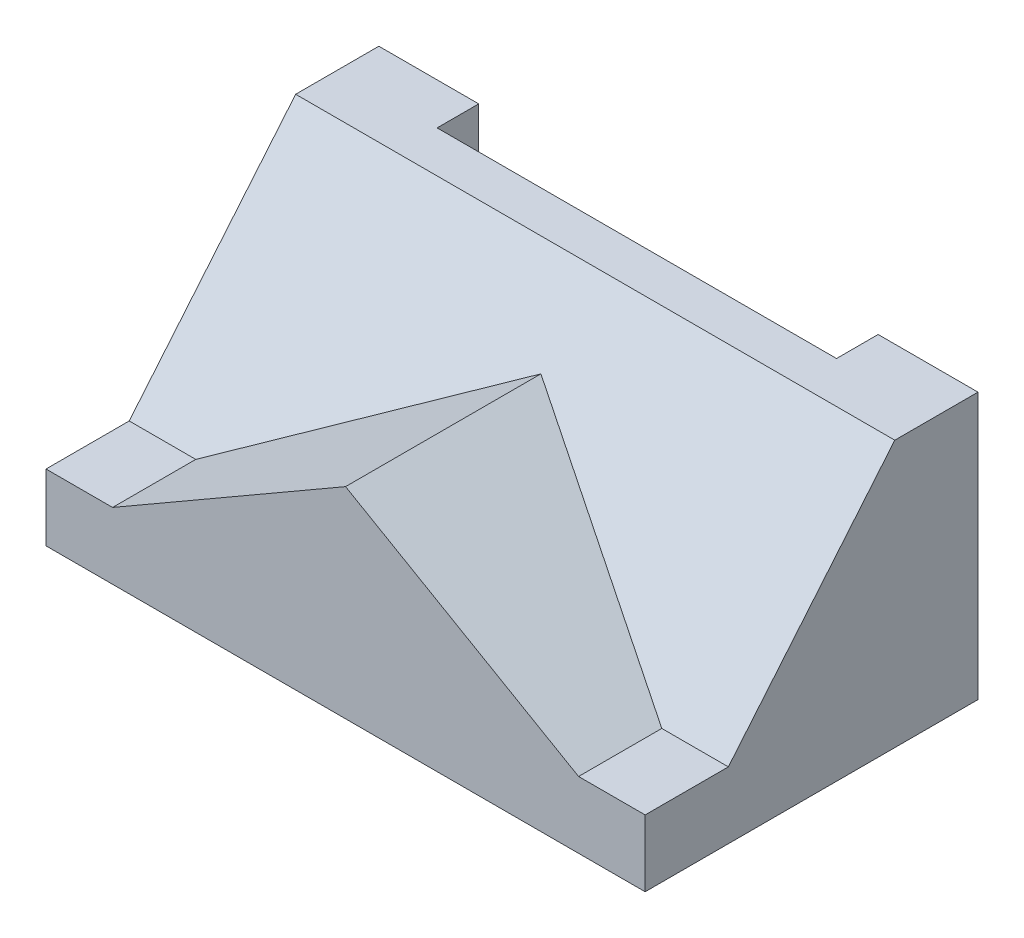
ISO-10303-21;
HEADER;
FILE_DESCRIPTION(('STEP AP214'),'2;1');
FILE_NAME('part.step','',(''),(''),'','','');
FILE_SCHEMA(('AUTOMOTIVE_DESIGN { 1 0 10303 214 1 1 1 1 }'));
ENDSEC;
DATA;
#1=APPLICATION_CONTEXT('core data for automotive mechanical design processes');
#2=APPLICATION_PROTOCOL_DEFINITION('international standard','automotive_design',2000,#1);
#3=PRODUCT_CONTEXT('',#1,'mechanical');
#4=PRODUCT('Part','Part','',(#3));
#5=PRODUCT_RELATED_PRODUCT_CATEGORY('part','',(#4));
#6=PRODUCT_DEFINITION_FORMATION('','',#4);
#7=PRODUCT_DEFINITION_CONTEXT('part definition',#1,'design');
#8=PRODUCT_DEFINITION('design','',#6,#7);
#9=PRODUCT_DEFINITION_SHAPE('','',#8);
#10=(LENGTH_UNIT() NAMED_UNIT(*) SI_UNIT(.MILLI.,.METRE.));
#11=(NAMED_UNIT(*) PLANE_ANGLE_UNIT() SI_UNIT($,.RADIAN.));
#12=(NAMED_UNIT(*) SI_UNIT($,.STERADIAN.) SOLID_ANGLE_UNIT());
#13=UNCERTAINTY_MEASURE_WITH_UNIT(LENGTH_MEASURE(1.E-05),#10,'distance_accuracy_value','');
#14=(GEOMETRIC_REPRESENTATION_CONTEXT(3) GLOBAL_UNCERTAINTY_ASSIGNED_CONTEXT((#13)) GLOBAL_UNIT_ASSIGNED_CONTEXT((#10,
#11,#12)) REPRESENTATION_CONTEXT('',''));
#15=CARTESIAN_POINT('',(0.,0.,0.));
#16=DIRECTION('',(0.,0.,1.));
#17=DIRECTION('',(1.,0.,0.));
#18=AXIS2_PLACEMENT_3D('',#15,#16,#17);
#19=CARTESIAN_POINT('',(-114.3,50.8,-15.875));
#20=DIRECTION('',(0.,0.64018439966448,0.768221279597376));
#21=DIRECTION('',(0.,-0.768221279597376,0.64018439966448));
#22=AXIS2_PLACEMENT_3D('',#19,#20,#21);
#23=PLANE('',#22);
#24=DIRECTION('',(-0.799408065031789,-0.461538461538462,0.384615384615385));
#25=VECTOR('',#24,1.);
#26=CARTESIAN_POINT('',(-5.32875091001085,68.2822315773269,-30.4435263144391));
#27=LINE('',#26,#25);
#28=CARTESIAN_POINT('',(-57.15,38.3632194654789,-5.51101622123245));
#29=VERTEX_POINT('',#28);
#30=CARTESIAN_POINT('',(-101.6,12.7,15.875));
#31=VERTEX_POINT('',#30);
#32=EDGE_CURVE('E49',#29,#31,#27,.T.);
#33=ORIENTED_EDGE('',*,*,#32,.F.);
#34=DIRECTION('',(-0.799408065031789,0.461538461538463,-0.384615384615385));
#35=VECTOR('',#34,1.);
#36=CARTESIAN_POINT('',(-35.9274621077408,26.110381500496,4.69968208291999));
#37=LINE('',#36,#35);
#38=CARTESIAN_POINT('',(-12.7,12.7,15.875));
#39=VERTEX_POINT('',#38);
#40=EDGE_CURVE('E222',#39,#29,#37,.T.);
#41=ORIENTED_EDGE('',*,*,#40,.F.);
#42=DIRECTION('',(1.,0.,0.));
#43=VECTOR('',#42,1.);
#44=CARTESIAN_POINT('',(-114.3,12.7,15.875));
#45=LINE('',#44,#43);
#46=CARTESIAN_POINT('',(0.,12.7,15.875));
#47=VERTEX_POINT('',#46);
#48=EDGE_CURVE('E147',#39,#47,#45,.T.);
#49=ORIENTED_EDGE('',*,*,#48,.T.);
#50=DIRECTION('',(0.,-0.768221279597376,0.64018439966448));
#51=VECTOR('',#50,1.);
#52=CARTESIAN_POINT('',(0.,50.8,-15.875));
#53=LINE('',#52,#51);
#54=CARTESIAN_POINT('',(0.,50.8,-15.875));
#55=VERTEX_POINT('',#54);
#56=EDGE_CURVE('E179',#55,#47,#53,.T.);
#57=ORIENTED_EDGE('',*,*,#56,.F.);
#58=DIRECTION('',(1.,0.,0.));
#59=VECTOR('',#58,1.);
#60=CARTESIAN_POINT('',(-114.3,50.8,-15.875));
#61=LINE('',#60,#59);
#62=CARTESIAN_POINT('',(-114.3,50.8,-15.875));
#63=VERTEX_POINT('',#62);
#64=EDGE_CURVE('E11',#63,#55,#61,.T.);
#65=ORIENTED_EDGE('',*,*,#64,.F.);
#66=DIRECTION('',(0.,-0.768221279597376,0.64018439966448));
#67=VECTOR('',#66,1.);
#68=CARTESIAN_POINT('',(-114.3,50.8,-15.875));
#69=LINE('',#68,#67);
#70=CARTESIAN_POINT('',(-114.3,12.7,15.875));
#71=VERTEX_POINT('',#70);
#72=EDGE_CURVE('E169',#63,#71,#69,.T.);
#73=ORIENTED_EDGE('',*,*,#72,.T.);
#74=EDGE_CURVE('E36',#71,#31,#45,.T.);
#75=ORIENTED_EDGE('',*,*,#74,.T.);
#76=EDGE_LOOP('',(#33,#41,#49,#57,#65,#73,#75));
#77=FACE_BOUND('',#76,.T.);
#78=ADVANCED_FACE('F33',(#77),#23,.T.);
#79=CARTESIAN_POINT('',(-114.3,12.7,15.875));
#80=DIRECTION('',(0.,1.,0.));
#81=DIRECTION('',(0.,0.,1.));
#82=AXIS2_PLACEMENT_3D('',#79,#80,#81);
#83=PLANE('',#82);
#84=ORIENTED_EDGE('',*,*,#48,.F.);
#85=DIRECTION('',(0.,0.,1.));
#86=VECTOR('',#85,1.);
#87=CARTESIAN_POINT('',(-12.7,12.7,-101.30660342681));
#88=LINE('',#87,#86);
#89=CARTESIAN_POINT('',(-12.7,12.7,31.75));
#90=VERTEX_POINT('',#89);
#91=EDGE_CURVE('E132',#39,#90,#88,.T.);
#92=ORIENTED_EDGE('',*,*,#91,.T.);
#93=DIRECTION('',(1.,0.,0.));
#94=VECTOR('',#93,1.);
#95=CARTESIAN_POINT('',(-114.3,12.7,31.75));
#96=LINE('',#95,#94);
#97=CARTESIAN_POINT('',(0.,12.7,31.75));
#98=VERTEX_POINT('',#97);
#99=EDGE_CURVE('E145',#90,#98,#96,.T.);
#100=ORIENTED_EDGE('',*,*,#99,.T.);
#101=DIRECTION('',(0.,0.,1.));
#102=VECTOR('',#101,1.);
#103=CARTESIAN_POINT('',(0.,12.7,15.875));
#104=LINE('',#103,#102);
#105=EDGE_CURVE('E177',#47,#98,#104,.T.);
#106=ORIENTED_EDGE('',*,*,#105,.F.);
#107=EDGE_LOOP('',(#84,#92,#100,#106));
#108=FACE_BOUND('',#107,.T.);
#109=ADVANCED_FACE('F143',(#108),#83,.T.);
#110=CARTESIAN_POINT('',(-114.3,12.7,31.75));
#111=VERTEX_POINT('',#110);
#112=CARTESIAN_POINT('',(-101.6,12.7,31.75));
#113=VERTEX_POINT('',#112);
#114=EDGE_CURVE('E153',#111,#113,#96,.T.);
#115=ORIENTED_EDGE('',*,*,#114,.T.);
#116=DIRECTION('',(0.,0.,1.));
#117=VECTOR('',#116,1.);
#118=CARTESIAN_POINT('',(-101.6,12.7,-101.30660342681));
#119=LINE('',#118,#117);
#120=EDGE_CURVE('E223',#31,#113,#119,.T.);
#121=ORIENTED_EDGE('',*,*,#120,.F.);
#122=ORIENTED_EDGE('',*,*,#74,.F.);
#123=DIRECTION('',(0.,0.,1.));
#124=VECTOR('',#123,1.);
#125=CARTESIAN_POINT('',(-114.3,12.7,15.875));
#126=LINE('',#125,#124);
#127=EDGE_CURVE('E195',#71,#111,#126,.T.);
#128=ORIENTED_EDGE('',*,*,#127,.T.);
#129=EDGE_LOOP('',(#115,#121,#122,#128));
#130=FACE_BOUND('',#129,.T.);
#131=ADVANCED_FACE('F231',(#130),#83,.T.);
#132=CARTESIAN_POINT('',(-114.3,0.,-31.75));
#133=DIRECTION('',(0.,0.,-1.));
#134=DIRECTION('',(-1.,0.,0.));
#135=AXIS2_PLACEMENT_3D('',#132,#133,#134);
#136=PLANE('',#135);
#137=DIRECTION('',(0.,1.,0.));
#138=VECTOR('',#137,1.);
#139=CARTESIAN_POINT('',(-95.25,0.,-31.75));
#140=LINE('',#139,#138);
#141=CARTESIAN_POINT('',(-95.25,0.,-31.75));
#142=VERTEX_POINT('',#141);
#143=CARTESIAN_POINT('',(-95.25,50.8,-31.75));
#144=VERTEX_POINT('',#143);
#145=EDGE_CURVE('E211',#142,#144,#140,.T.);
#146=ORIENTED_EDGE('',*,*,#145,.F.);
#147=DIRECTION('',(1.,0.,0.));
#148=VECTOR('',#147,1.);
#149=CARTESIAN_POINT('',(-114.3,0.,-31.75));
#150=LINE('',#149,#148);
#151=CARTESIAN_POINT('',(-114.3,0.,-31.75));
#152=VERTEX_POINT('',#151);
#153=EDGE_CURVE('E160',#152,#142,#150,.T.);
#154=ORIENTED_EDGE('',*,*,#153,.F.);
#155=DIRECTION('',(0.,1.,0.));
#156=VECTOR('',#155,1.);
#157=CARTESIAN_POINT('',(-114.3,0.,-31.75));
#158=LINE('',#157,#156);
#159=CARTESIAN_POINT('',(-114.3,50.8,-31.75));
#160=VERTEX_POINT('',#159);
#161=EDGE_CURVE('E186',#152,#160,#158,.T.);
#162=ORIENTED_EDGE('',*,*,#161,.T.);
#163=DIRECTION('',(1.,0.,0.));
#164=VECTOR('',#163,1.);
#165=CARTESIAN_POINT('',(-114.3,50.8,-31.75));
#166=LINE('',#165,#164);
#167=EDGE_CURVE('E41',#160,#144,#166,.T.);
#168=ORIENTED_EDGE('',*,*,#167,.T.);
#169=EDGE_LOOP('',(#146,#154,#162,#168));
#170=FACE_BOUND('',#169,.T.);
#171=ADVANCED_FACE('F265',(#170),#136,.T.);
#172=CARTESIAN_POINT('',(-114.3,50.8,-31.75));
#173=DIRECTION('',(0.,1.,0.));
#174=DIRECTION('',(0.,0.,1.));
#175=AXIS2_PLACEMENT_3D('',#172,#173,#174);
#176=PLANE('',#175);
#177=DIRECTION('',(0.,0.,1.));
#178=VECTOR('',#177,1.);
#179=CARTESIAN_POINT('',(-95.25,50.8,-31.75));
#180=LINE('',#179,#178);
#181=CARTESIAN_POINT('',(-95.25,50.8,-23.8125));
#182=VERTEX_POINT('',#181);
#183=EDGE_CURVE('E201',#144,#182,#180,.T.);
#184=ORIENTED_EDGE('',*,*,#183,.F.);
#185=ORIENTED_EDGE('',*,*,#167,.F.);
#186=DIRECTION('',(0.,0.,1.));
#187=VECTOR('',#186,1.);
#188=CARTESIAN_POINT('',(-114.3,50.8,-31.75));
#189=LINE('',#188,#187);
#190=EDGE_CURVE('E183',#160,#63,#189,.T.);
#191=ORIENTED_EDGE('',*,*,#190,.T.);
#192=ORIENTED_EDGE('',*,*,#64,.T.);
#193=DIRECTION('',(0.,0.,1.));
#194=VECTOR('',#193,1.);
#195=CARTESIAN_POINT('',(0.,50.8,-31.75));
#196=LINE('',#195,#194);
#197=CARTESIAN_POINT('',(0.,50.8,-31.75));
#198=VERTEX_POINT('',#197);
#199=EDGE_CURVE('E166',#198,#55,#196,.T.);
#200=ORIENTED_EDGE('',*,*,#199,.F.);
#201=CARTESIAN_POINT('',(-19.05,50.8,-31.75));
#202=VERTEX_POINT('',#201);
#203=EDGE_CURVE('E163',#202,#198,#166,.T.);
#204=ORIENTED_EDGE('',*,*,#203,.F.);
#205=DIRECTION('',(0.,0.,-1.));
#206=VECTOR('',#205,1.);
#207=CARTESIAN_POINT('',(-19.05,50.8,-31.75));
#208=LINE('',#207,#206);
#209=CARTESIAN_POINT('',(-19.05,50.8,-23.8125));
#210=VERTEX_POINT('',#209);
#211=EDGE_CURVE('E203',#210,#202,#208,.T.);
#212=ORIENTED_EDGE('',*,*,#211,.F.);
#213=DIRECTION('',(1.,0.,0.));
#214=VECTOR('',#213,1.);
#215=CARTESIAN_POINT('',(-114.3,50.8,-23.8125));
#216=LINE('',#215,#214);
#217=EDGE_CURVE('E182',#182,#210,#216,.T.);
#218=ORIENTED_EDGE('',*,*,#217,.F.);
#219=EDGE_LOOP('',(#184,#185,#191,#192,#200,#204,#212,#218));
#220=FACE_BOUND('',#219,.T.);
#221=ADVANCED_FACE('F243',(#220),#176,.T.);
#222=DIRECTION('',(0.,1.,0.));
#223=VECTOR('',#222,1.);
#224=CARTESIAN_POINT('',(-19.05,0.,-31.75));
#225=LINE('',#224,#223);
#226=CARTESIAN_POINT('',(-19.05,0.,-31.75));
#227=VERTEX_POINT('',#226);
#228=EDGE_CURVE('E57',#227,#202,#225,.T.);
#229=ORIENTED_EDGE('',*,*,#228,.T.);
#230=ORIENTED_EDGE('',*,*,#203,.T.);
#231=DIRECTION('',(0.,1.,0.));
#232=VECTOR('',#231,1.);
#233=CARTESIAN_POINT('',(0.,0.,-31.75));
#234=LINE('',#233,#232);
#235=CARTESIAN_POINT('',(0.,0.,-31.75));
#236=VERTEX_POINT('',#235);
#237=EDGE_CURVE('E170',#236,#198,#234,.T.);
#238=ORIENTED_EDGE('',*,*,#237,.F.);
#239=EDGE_CURVE('E159',#227,#236,#150,.T.);
#240=ORIENTED_EDGE('',*,*,#239,.F.);
#241=EDGE_LOOP('',(#229,#230,#238,#240));
#242=FACE_BOUND('',#241,.T.);
#243=ADVANCED_FACE('F255',(#242),#136,.T.);
#244=CARTESIAN_POINT('',(-114.3,0.,31.75));
#245=DIRECTION('',(0.,-1.,0.));
#246=DIRECTION('',(0.,0.,-1.));
#247=AXIS2_PLACEMENT_3D('',#244,#245,#246);
#248=PLANE('',#247);
#249=DIRECTION('',(0.,0.,1.));
#250=VECTOR('',#249,1.);
#251=CARTESIAN_POINT('',(-95.2499999999999,0.,1.66533453693773E-13));
#252=LINE('',#251,#250);
#253=CARTESIAN_POINT('',(-95.25,0.,-23.8125));
#254=VERTEX_POINT('',#253);
#255=EDGE_CURVE('E209',#142,#254,#252,.T.);
#256=ORIENTED_EDGE('',*,*,#255,.T.);
#257=DIRECTION('',(1.,0.,0.));
#258=VECTOR('',#257,1.);
#259=CARTESIAN_POINT('',(0.,0.,-23.8125));
#260=LINE('',#259,#258);
#261=CARTESIAN_POINT('',(-19.05,0.,-23.8125));
#262=VERTEX_POINT('',#261);
#263=EDGE_CURVE('E219',#254,#262,#260,.T.);
#264=ORIENTED_EDGE('',*,*,#263,.T.);
#265=DIRECTION('',(0.,0.,-1.));
#266=VECTOR('',#265,1.);
#267=CARTESIAN_POINT('',(-19.05,0.,0.));
#268=LINE('',#267,#266);
#269=EDGE_CURVE('E217',#262,#227,#268,.T.);
#270=ORIENTED_EDGE('',*,*,#269,.T.);
#271=ORIENTED_EDGE('',*,*,#239,.T.);
#272=DIRECTION('',(0.,0.,-1.));
#273=VECTOR('',#272,1.);
#274=CARTESIAN_POINT('',(0.,0.,31.75));
#275=LINE('',#274,#273);
#276=CARTESIAN_POINT('',(0.,0.,31.75));
#277=VERTEX_POINT('',#276);
#278=EDGE_CURVE('E173',#277,#236,#275,.T.);
#279=ORIENTED_EDGE('',*,*,#278,.F.);
#280=DIRECTION('',(1.,0.,0.));
#281=VECTOR('',#280,1.);
#282=CARTESIAN_POINT('',(-114.3,0.,31.75));
#283=LINE('',#282,#281);
#284=CARTESIAN_POINT('',(-114.3,0.,31.75));
#285=VERTEX_POINT('',#284);
#286=EDGE_CURVE('E155',#285,#277,#283,.T.);
#287=ORIENTED_EDGE('',*,*,#286,.F.);
#288=DIRECTION('',(0.,0.,-1.));
#289=VECTOR('',#288,1.);
#290=CARTESIAN_POINT('',(-114.3,0.,31.75));
#291=LINE('',#290,#289);
#292=EDGE_CURVE('E189',#285,#152,#291,.T.);
#293=ORIENTED_EDGE('',*,*,#292,.T.);
#294=ORIENTED_EDGE('',*,*,#153,.T.);
#295=EDGE_LOOP('',(#256,#264,#270,#271,#279,#287,#293,#294));
#296=FACE_BOUND('',#295,.T.);
#297=ADVANCED_FACE('F248',(#296),#248,.T.);
#298=CARTESIAN_POINT('',(-114.3,12.7,31.75));
#299=DIRECTION('',(0.,0.,1.));
#300=DIRECTION('',(0.,-1.,0.));
#301=AXIS2_PLACEMENT_3D('',#298,#299,#300);
#302=PLANE('',#301);
#303=DIRECTION('',(0.,-1.,0.));
#304=VECTOR('',#303,1.);
#305=CARTESIAN_POINT('',(0.,12.7,31.75));
#306=LINE('',#305,#304);
#307=EDGE_CURVE('E151',#98,#277,#306,.T.);
#308=ORIENTED_EDGE('',*,*,#307,.F.);
#309=ORIENTED_EDGE('',*,*,#99,.F.);
#310=DIRECTION('',(0.866025403784438,-0.500000000000001,0.));
#311=VECTOR('',#310,1.);
#312=CARTESIAN_POINT('',(2.32426131403118,4.02573868596879,31.75));
#313=LINE('',#312,#311);
#314=CARTESIAN_POINT('',(-57.15,38.3632194654789,31.75));
#315=VERTEX_POINT('',#314);
#316=EDGE_CURVE('E128',#315,#90,#313,.T.);
#317=ORIENTED_EDGE('',*,*,#316,.F.);
#318=DIRECTION('',(0.866025403784438,0.500000000000001,0.));
#319=VECTOR('',#318,1.);
#320=CARTESIAN_POINT('',(-30.8992613140313,53.5190905122495,31.75));
#321=LINE('',#320,#319);
#322=EDGE_CURVE('E139',#113,#315,#321,.T.);
#323=ORIENTED_EDGE('',*,*,#322,.F.);
#324=ORIENTED_EDGE('',*,*,#114,.F.);
#325=DIRECTION('',(0.,-1.,0.));
#326=VECTOR('',#325,1.);
#327=CARTESIAN_POINT('',(-114.3,12.7,31.75));
#328=LINE('',#327,#326);
#329=EDGE_CURVE('E192',#111,#285,#328,.T.);
#330=ORIENTED_EDGE('',*,*,#329,.T.);
#331=ORIENTED_EDGE('',*,*,#286,.T.);
#332=EDGE_LOOP('',(#308,#309,#317,#323,#324,#330,#331));
#333=FACE_BOUND('',#332,.T.);
#334=ADVANCED_FACE('F149',(#333),#302,.T.);
#335=CARTESIAN_POINT('',(-114.3,0.,0.));
#336=DIRECTION('',(-1.,0.,0.));
#337=DIRECTION('',(0.,0.,1.));
#338=AXIS2_PLACEMENT_3D('',#335,#336,#337);
#339=PLANE('',#338);
#340=ORIENTED_EDGE('',*,*,#72,.F.);
#341=ORIENTED_EDGE('',*,*,#190,.F.);
#342=ORIENTED_EDGE('',*,*,#161,.F.);
#343=ORIENTED_EDGE('',*,*,#292,.F.);
#344=ORIENTED_EDGE('',*,*,#329,.F.);
#345=ORIENTED_EDGE('',*,*,#127,.F.);
#346=EDGE_LOOP('',(#340,#341,#342,#343,#344,#345));
#347=FACE_BOUND('',#346,.T.);
#348=ADVANCED_FACE('F235',(#347),#339,.T.);
#349=CARTESIAN_POINT('',(0.,0.,0.));
#350=DIRECTION('',(-1.,0.,0.));
#351=DIRECTION('',(0.,0.,1.));
#352=AXIS2_PLACEMENT_3D('',#349,#350,#351);
#353=PLANE('',#352);
#354=ORIENTED_EDGE('',*,*,#56,.T.);
#355=ORIENTED_EDGE('',*,*,#105,.T.);
#356=ORIENTED_EDGE('',*,*,#307,.T.);
#357=ORIENTED_EDGE('',*,*,#278,.T.);
#358=ORIENTED_EDGE('',*,*,#237,.T.);
#359=ORIENTED_EDGE('',*,*,#199,.T.);
#360=EDGE_LOOP('',(#354,#355,#356,#357,#358,#359));
#361=FACE_BOUND('',#360,.T.);
#362=ADVANCED_FACE('F253',(#361),#353,.F.);
#363=CARTESIAN_POINT('',(0.,0.,-23.8125));
#364=DIRECTION('',(0.,0.,1.));
#365=DIRECTION('',(1.,0.,0.));
#366=AXIS2_PLACEMENT_3D('',#363,#364,#365);
#367=PLANE('',#366);
#368=ORIENTED_EDGE('',*,*,#217,.T.);
#369=DIRECTION('',(0.,1.,0.));
#370=VECTOR('',#369,1.);
#371=CARTESIAN_POINT('',(-19.05,0.,-23.8125));
#372=LINE('',#371,#370);
#373=EDGE_CURVE('E206',#262,#210,#372,.T.);
#374=ORIENTED_EDGE('',*,*,#373,.F.);
#375=ORIENTED_EDGE('',*,*,#263,.F.);
#376=DIRECTION('',(0.,1.,0.));
#377=VECTOR('',#376,1.);
#378=CARTESIAN_POINT('',(-95.25,0.,-23.8125));
#379=LINE('',#378,#377);
#380=EDGE_CURVE('E205',#254,#182,#379,.T.);
#381=ORIENTED_EDGE('',*,*,#380,.T.);
#382=EDGE_LOOP('',(#368,#374,#375,#381));
#383=FACE_BOUND('',#382,.T.);
#384=ADVANCED_FACE('F261',(#383),#367,.F.);
#385=CARTESIAN_POINT('',(-95.2499999999999,0.,1.66533453693773E-13));
#386=DIRECTION('',(-1.,0.,0.));
#387=DIRECTION('',(0.,0.,1.));
#388=AXIS2_PLACEMENT_3D('',#385,#386,#387);
#389=PLANE('',#388);
#390=ORIENTED_EDGE('',*,*,#183,.T.);
#391=ORIENTED_EDGE('',*,*,#380,.F.);
#392=ORIENTED_EDGE('',*,*,#255,.F.);
#393=ORIENTED_EDGE('',*,*,#145,.T.);
#394=EDGE_LOOP('',(#390,#391,#392,#393));
#395=FACE_BOUND('',#394,.T.);
#396=ADVANCED_FACE('F263',(#395),#389,.F.);
#397=CARTESIAN_POINT('',(-19.05,0.,0.));
#398=DIRECTION('',(1.,0.,0.));
#399=DIRECTION('',(0.,0.,-1.));
#400=AXIS2_PLACEMENT_3D('',#397,#398,#399);
#401=PLANE('',#400);
#402=ORIENTED_EDGE('',*,*,#211,.T.);
#403=ORIENTED_EDGE('',*,*,#228,.F.);
#404=ORIENTED_EDGE('',*,*,#269,.F.);
#405=ORIENTED_EDGE('',*,*,#373,.T.);
#406=EDGE_LOOP('',(#402,#403,#404,#405));
#407=FACE_BOUND('',#406,.T.);
#408=ADVANCED_FACE('F258',(#407),#401,.F.);
#409=CARTESIAN_POINT('',(2.32426131403118,4.02573868596879,-101.30660342681));
#410=DIRECTION('',(-0.500000000000001,-0.866025403784438,0.));
#411=DIRECTION('',(0.866025403784438,-0.500000000000001,0.));
#412=AXIS2_PLACEMENT_3D('',#409,#410,#411);
#413=PLANE('',#412);
#414=ORIENTED_EDGE('',*,*,#91,.F.);
#415=ORIENTED_EDGE('',*,*,#40,.T.);
#416=DIRECTION('',(0.,0.,1.));
#417=VECTOR('',#416,1.);
#418=CARTESIAN_POINT('',(-57.15,38.3632194654789,-101.30660342681));
#419=LINE('',#418,#417);
#420=EDGE_CURVE('E134',#29,#315,#419,.T.);
#421=ORIENTED_EDGE('',*,*,#420,.T.);
#422=ORIENTED_EDGE('',*,*,#316,.T.);
#423=EDGE_LOOP('',(#414,#415,#421,#422));
#424=FACE_BOUND('',#423,.T.);
#425=ADVANCED_FACE('F130',(#424),#413,.F.);
#426=CARTESIAN_POINT('',(-30.8992613140313,53.5190905122495,-101.30660342681));
#427=DIRECTION('',(0.500000000000001,-0.866025403784438,0.));
#428=DIRECTION('',(0.866025403784438,0.500000000000001,0.));
#429=AXIS2_PLACEMENT_3D('',#426,#427,#428);
#430=PLANE('',#429);
#431=ORIENTED_EDGE('',*,*,#420,.F.);
#432=ORIENTED_EDGE('',*,*,#32,.T.);
#433=ORIENTED_EDGE('',*,*,#120,.T.);
#434=ORIENTED_EDGE('',*,*,#322,.T.);
#435=EDGE_LOOP('',(#431,#432,#433,#434));
#436=FACE_BOUND('',#435,.T.);
#437=ADVANCED_FACE('F228',(#436),#430,.F.);
#438=CLOSED_SHELL('',(#78,#109,#131,#171,#221,#243,#297,#334,#348,#362,#384,#396,#408,#425,#437));
#439=MANIFOLD_SOLID_BREP('B2',#438);
#440=ADVANCED_BREP_SHAPE_REPRESENTATION('',(#18,#439),#14);
#441=SHAPE_DEFINITION_REPRESENTATION(#9,#440);
ENDSEC;
END-ISO-10303-21;
